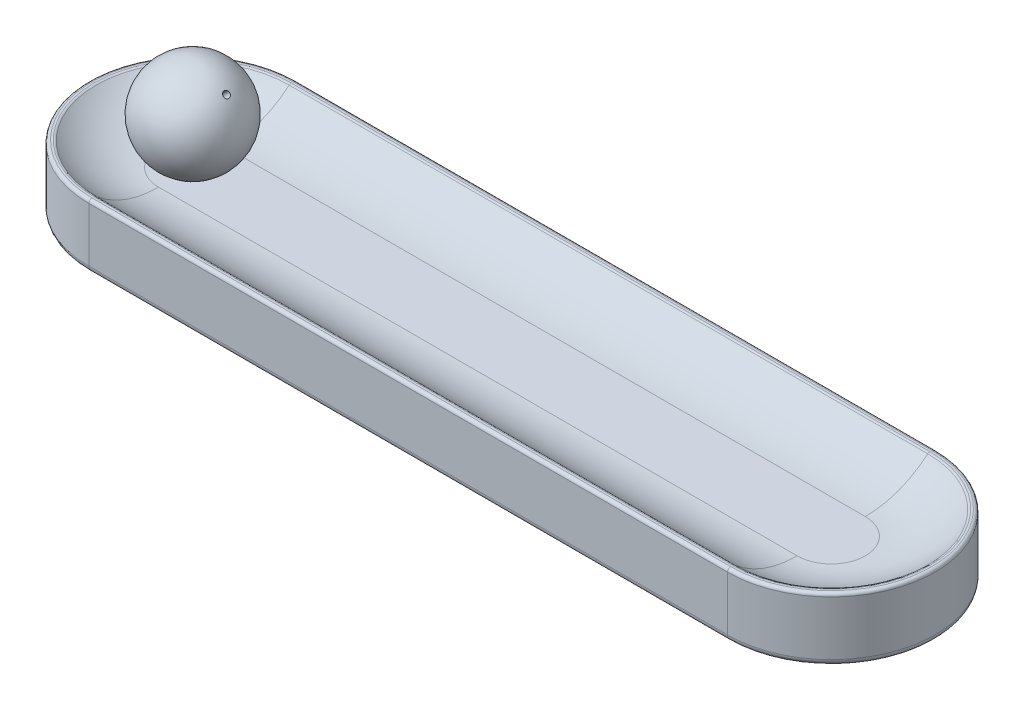
ISO-10303-21;
HEADER;
FILE_DESCRIPTION(('STEP AP214'),'2;1');
FILE_NAME('part.step','',(''),(''),'','','');
FILE_SCHEMA(('AUTOMOTIVE_DESIGN { 1 0 10303 214 1 1 1 1 }'));
ENDSEC;
DATA;
#1=APPLICATION_CONTEXT('core data for automotive mechanical design processes');
#2=APPLICATION_PROTOCOL_DEFINITION('international standard','automotive_design',2000,#1);
#3=PRODUCT_CONTEXT('',#1,'mechanical');
#4=PRODUCT('Part','Part','',(#3));
#5=PRODUCT_RELATED_PRODUCT_CATEGORY('part','',(#4));
#6=PRODUCT_DEFINITION_FORMATION('','',#4);
#7=PRODUCT_DEFINITION_CONTEXT('part definition',#1,'design');
#8=PRODUCT_DEFINITION('design','',#6,#7);
#9=PRODUCT_DEFINITION_SHAPE('','',#8);
#10=(LENGTH_UNIT() NAMED_UNIT(*) SI_UNIT(.MILLI.,.METRE.));
#11=(NAMED_UNIT(*) PLANE_ANGLE_UNIT() SI_UNIT($,.RADIAN.));
#12=(NAMED_UNIT(*) SI_UNIT($,.STERADIAN.) SOLID_ANGLE_UNIT());
#13=UNCERTAINTY_MEASURE_WITH_UNIT(LENGTH_MEASURE(1.E-05),#10,'distance_accuracy_value','');
#14=(GEOMETRIC_REPRESENTATION_CONTEXT(3) GLOBAL_UNCERTAINTY_ASSIGNED_CONTEXT((#13)) GLOBAL_UNIT_ASSIGNED_CONTEXT((#10,
#11,#12)) REPRESENTATION_CONTEXT('',''));
#15=CARTESIAN_POINT('',(0.,0.,0.));
#16=DIRECTION('',(0.,0.,1.));
#17=DIRECTION('',(1.,0.,0.));
#18=AXIS2_PLACEMENT_3D('',#15,#16,#17);
#19=CARTESIAN_POINT('',(-100.,20.,0.));
#20=DIRECTION('',(0.,-1.,0.));
#21=DIRECTION('',(0.,0.,-1.));
#22=AXIS2_PLACEMENT_3D('',#19,#20,#21);
#23=CYLINDRICAL_SURFACE('',#22,32.5);
#24=DIRECTION('',(0.,-1.,0.));
#25=VECTOR('',#24,1.);
#26=CARTESIAN_POINT('',(-100.,20.,-32.5));
#27=LINE('',#26,#25);
#28=CARTESIAN_POINT('',(-100.,19.,-32.5));
#29=VERTEX_POINT('',#28);
#30=CARTESIAN_POINT('',(-100.,2.,-32.5));
#31=VERTEX_POINT('',#30);
#32=EDGE_CURVE('E189',#29,#31,#27,.T.);
#33=ORIENTED_EDGE('',*,*,#32,.T.);
#34=CARTESIAN_POINT('',(-100.,2.,0.));
#35=DIRECTION('',(0.,1.,0.));
#36=DIRECTION('',(0.,0.,1.));
#37=AXIS2_PLACEMENT_3D('',#34,#35,#36);
#38=CIRCLE('',#37,32.5);
#39=CARTESIAN_POINT('',(-100.,2.,32.5));
#40=VERTEX_POINT('',#39);
#41=EDGE_CURVE('E11',#31,#40,#38,.T.);
#42=ORIENTED_EDGE('',*,*,#41,.T.);
#43=DIRECTION('',(0.,-1.,0.));
#44=VECTOR('',#43,1.);
#45=CARTESIAN_POINT('',(-100.,20.,32.5));
#46=LINE('',#45,#44);
#47=CARTESIAN_POINT('',(-100.,19.,32.5));
#48=VERTEX_POINT('',#47);
#49=EDGE_CURVE('E167',#48,#40,#46,.T.);
#50=ORIENTED_EDGE('',*,*,#49,.F.);
#51=CARTESIAN_POINT('',(-100.,19.,0.));
#52=DIRECTION('',(0.,1.,0.));
#53=DIRECTION('',(0.,0.,1.));
#54=AXIS2_PLACEMENT_3D('',#51,#52,#53);
#55=CIRCLE('',#54,32.5);
#56=EDGE_CURVE('E235',#48,#29,#55,.F.);
#57=ORIENTED_EDGE('',*,*,#56,.T.);
#58=EDGE_LOOP('',(#33,#42,#50,#57));
#59=FACE_BOUND('',#58,.T.);
#60=ADVANCED_FACE('F39',(#59),#23,.T.);
#61=CARTESIAN_POINT('',(-100.,20.,32.5));
#62=DIRECTION('',(0.,0.,-1.));
#63=DIRECTION('',(-1.,0.,0.));
#64=AXIS2_PLACEMENT_3D('',#61,#62,#63);
#65=PLANE('',#64);
#66=ORIENTED_EDGE('',*,*,#49,.T.);
#67=DIRECTION('',(1.,0.,0.));
#68=VECTOR('',#67,1.);
#69=CARTESIAN_POINT('',(-100.,2.,32.5));
#70=LINE('',#69,#68);
#71=CARTESIAN_POINT('',(100.,2.,32.5));
#72=VERTEX_POINT('',#71);
#73=EDGE_CURVE('E238',#40,#72,#70,.T.);
#74=ORIENTED_EDGE('',*,*,#73,.T.);
#75=DIRECTION('',(0.,-1.,0.));
#76=VECTOR('',#75,1.);
#77=CARTESIAN_POINT('',(100.,20.,32.5));
#78=LINE('',#77,#76);
#79=CARTESIAN_POINT('',(100.,19.,32.5));
#80=VERTEX_POINT('',#79);
#81=EDGE_CURVE('E320',#80,#72,#78,.T.);
#82=ORIENTED_EDGE('',*,*,#81,.F.);
#83=DIRECTION('',(1.,0.,0.));
#84=VECTOR('',#83,1.);
#85=CARTESIAN_POINT('',(-100.,19.,32.5));
#86=LINE('',#85,#84);
#87=EDGE_CURVE('E229',#80,#48,#86,.F.);
#88=ORIENTED_EDGE('',*,*,#87,.T.);
#89=EDGE_LOOP('',(#66,#74,#82,#88));
#90=FACE_BOUND('',#89,.T.);
#91=ADVANCED_FACE('F380',(#90),#65,.F.);
#92=CARTESIAN_POINT('',(100.,20.,0.));
#93=DIRECTION('',(0.,-1.,0.));
#94=DIRECTION('',(0.,0.,-1.));
#95=AXIS2_PLACEMENT_3D('',#92,#93,#94);
#96=CYLINDRICAL_SURFACE('',#95,32.5);
#97=ORIENTED_EDGE('',*,*,#81,.T.);
#98=CARTESIAN_POINT('',(100.,2.,0.));
#99=DIRECTION('',(0.,1.,0.));
#100=DIRECTION('',(0.,0.,1.));
#101=AXIS2_PLACEMENT_3D('',#98,#99,#100);
#102=CIRCLE('',#101,32.5);
#103=CARTESIAN_POINT('',(100.,2.,-32.5));
#104=VERTEX_POINT('',#103);
#105=EDGE_CURVE('E64',#72,#104,#102,.T.);
#106=ORIENTED_EDGE('',*,*,#105,.T.);
#107=DIRECTION('',(0.,-1.,0.));
#108=VECTOR('',#107,1.);
#109=CARTESIAN_POINT('',(100.,20.,-32.5));
#110=LINE('',#109,#108);
#111=CARTESIAN_POINT('',(100.,19.,-32.5));
#112=VERTEX_POINT('',#111);
#113=EDGE_CURVE('E317',#112,#104,#110,.T.);
#114=ORIENTED_EDGE('',*,*,#113,.F.);
#115=CARTESIAN_POINT('',(100.,19.,0.));
#116=DIRECTION('',(0.,1.,0.));
#117=DIRECTION('',(0.,0.,1.));
#118=AXIS2_PLACEMENT_3D('',#115,#116,#117);
#119=CIRCLE('',#118,32.5);
#120=EDGE_CURVE('E226',#112,#80,#119,.F.);
#121=ORIENTED_EDGE('',*,*,#120,.T.);
#122=EDGE_LOOP('',(#97,#106,#114,#121));
#123=FACE_BOUND('',#122,.T.);
#124=ADVANCED_FACE('F393',(#123),#96,.T.);
#125=CARTESIAN_POINT('',(-100.,20.,-32.5));
#126=DIRECTION('',(0.,0.,1.));
#127=DIRECTION('',(1.,0.,0.));
#128=AXIS2_PLACEMENT_3D('',#125,#126,#127);
#129=PLANE('',#128);
#130=ORIENTED_EDGE('',*,*,#113,.T.);
#131=DIRECTION('',(-1.,0.,0.));
#132=VECTOR('',#131,1.);
#133=CARTESIAN_POINT('',(-100.,2.,-32.5));
#134=LINE('',#133,#132);
#135=EDGE_CURVE('E49',#104,#31,#134,.T.);
#136=ORIENTED_EDGE('',*,*,#135,.T.);
#137=ORIENTED_EDGE('',*,*,#32,.F.);
#138=DIRECTION('',(-1.,0.,0.));
#139=VECTOR('',#138,1.);
#140=CARTESIAN_POINT('',(100.,19.,-32.5));
#141=LINE('',#140,#139);
#142=EDGE_CURVE('E222',#29,#112,#141,.F.);
#143=ORIENTED_EDGE('',*,*,#142,.T.);
#144=EDGE_LOOP('',(#130,#136,#137,#143));
#145=FACE_BOUND('',#144,.T.);
#146=ADVANCED_FACE('F355',(#145),#129,.F.);
#147=CARTESIAN_POINT('',(-100.,20.,0.));
#148=DIRECTION('',(0.,1.,0.));
#149=DIRECTION('',(0.,0.,1.));
#150=AXIS2_PLACEMENT_3D('',#147,#148,#149);
#151=PLANE('',#150);
#152=DIRECTION('',(1.,0.,0.));
#153=VECTOR('',#152,1.);
#154=CARTESIAN_POINT('',(-100.,20.,30.8744317861713));
#155=LINE('',#154,#153);
#156=CARTESIAN_POINT('',(100.,20.,30.8744317861713));
#157=VERTEX_POINT('',#156);
#158=CARTESIAN_POINT('',(-100.,20.,30.8744317861713));
#159=VERTEX_POINT('',#158);
#160=EDGE_CURVE('E203',#157,#159,#155,.F.);
#161=ORIENTED_EDGE('',*,*,#160,.T.);
#162=CARTESIAN_POINT('',(-100.,20.,0.));
#163=DIRECTION('',(0.,1.,0.));
#164=DIRECTION('',(0.,0.,1.));
#165=AXIS2_PLACEMENT_3D('',#162,#163,#164);
#166=CIRCLE('',#165,30.8744317861713);
#167=CARTESIAN_POINT('',(-100.,20.,-30.8744317861713));
#168=VERTEX_POINT('',#167);
#169=EDGE_CURVE('E212',#159,#168,#166,.F.);
#170=ORIENTED_EDGE('',*,*,#169,.T.);
#171=DIRECTION('',(-1.,0.,0.));
#172=VECTOR('',#171,1.);
#173=CARTESIAN_POINT('',(100.,20.,-30.8744317861713));
#174=LINE('',#173,#172);
#175=CARTESIAN_POINT('',(100.,20.,-30.8744317861713));
#176=VERTEX_POINT('',#175);
#177=EDGE_CURVE('E209',#168,#176,#174,.F.);
#178=ORIENTED_EDGE('',*,*,#177,.T.);
#179=CARTESIAN_POINT('',(100.,20.,0.));
#180=DIRECTION('',(0.,1.,0.));
#181=DIRECTION('',(0.,0.,1.));
#182=AXIS2_PLACEMENT_3D('',#179,#180,#181);
#183=CIRCLE('',#182,30.8744317861713);
#184=EDGE_CURVE('E206',#176,#157,#183,.F.);
#185=ORIENTED_EDGE('',*,*,#184,.T.);
#186=EDGE_LOOP('',(#161,#170,#178,#185));
#187=FACE_BOUND('',#186,.T.);
#188=CARTESIAN_POINT('',(100.,20.,0.));
#189=DIRECTION('',(0.,1.,0.));
#190=DIRECTION('',(0.,0.,1.));
#191=AXIS2_PLACEMENT_3D('',#188,#189,#190);
#192=CIRCLE('',#191,31.5);
#193=CARTESIAN_POINT('',(100.,20.,31.5));
#194=VERTEX_POINT('',#193);
#195=CARTESIAN_POINT('',(100.,20.,-31.5));
#196=VERTEX_POINT('',#195);
#197=EDGE_CURVE('E196',#194,#196,#192,.T.);
#198=ORIENTED_EDGE('',*,*,#197,.T.);
#199=DIRECTION('',(-1.,0.,0.));
#200=VECTOR('',#199,1.);
#201=CARTESIAN_POINT('',(-100.,20.,-31.5));
#202=LINE('',#201,#200);
#203=CARTESIAN_POINT('',(-100.,20.,-31.5));
#204=VERTEX_POINT('',#203);
#205=EDGE_CURVE('E199',#196,#204,#202,.T.);
#206=ORIENTED_EDGE('',*,*,#205,.T.);
#207=CARTESIAN_POINT('',(-100.,20.,0.));
#208=DIRECTION('',(0.,1.,0.));
#209=DIRECTION('',(0.,0.,1.));
#210=AXIS2_PLACEMENT_3D('',#207,#208,#209);
#211=CIRCLE('',#210,31.5);
#212=CARTESIAN_POINT('',(-100.,20.,31.5));
#213=VERTEX_POINT('',#212);
#214=EDGE_CURVE('E177',#204,#213,#211,.T.);
#215=ORIENTED_EDGE('',*,*,#214,.T.);
#216=DIRECTION('',(1.,0.,0.));
#217=VECTOR('',#216,1.);
#218=CARTESIAN_POINT('',(100.,20.,31.5));
#219=LINE('',#218,#217);
#220=EDGE_CURVE('E193',#213,#194,#219,.T.);
#221=ORIENTED_EDGE('',*,*,#220,.T.);
#222=EDGE_LOOP('',(#198,#206,#215,#221));
#223=FACE_BOUND('',#222,.T.);
#224=ADVANCED_FACE('F351',(#187,#223),#151,.T.);
#225=CARTESIAN_POINT('',(-100.,0.,0.));
#226=DIRECTION('',(0.,1.,0.));
#227=DIRECTION('',(0.,0.,1.));
#228=AXIS2_PLACEMENT_3D('',#225,#226,#227);
#229=PLANE('',#228);
#230=CARTESIAN_POINT('',(100.,0.,0.));
#231=DIRECTION('',(0.,1.,0.));
#232=DIRECTION('',(0.,0.,1.));
#233=AXIS2_PLACEMENT_3D('',#230,#231,#232);
#234=CIRCLE('',#233,30.5);
#235=CARTESIAN_POINT('',(100.,0.,-30.5));
#236=VERTEX_POINT('',#235);
#237=CARTESIAN_POINT('',(100.,0.,30.5));
#238=VERTEX_POINT('',#237);
#239=EDGE_CURVE('E276',#236,#238,#234,.F.);
#240=ORIENTED_EDGE('',*,*,#239,.T.);
#241=DIRECTION('',(1.,0.,0.));
#242=VECTOR('',#241,1.);
#243=CARTESIAN_POINT('',(-100.,0.,30.5));
#244=LINE('',#243,#242);
#245=CARTESIAN_POINT('',(-100.,0.,30.5));
#246=VERTEX_POINT('',#245);
#247=EDGE_CURVE('E279',#238,#246,#244,.F.);
#248=ORIENTED_EDGE('',*,*,#247,.T.);
#249=CARTESIAN_POINT('',(-100.,0.,0.));
#250=DIRECTION('',(0.,1.,0.));
#251=DIRECTION('',(0.,0.,1.));
#252=AXIS2_PLACEMENT_3D('',#249,#250,#251);
#253=CIRCLE('',#252,30.5);
#254=CARTESIAN_POINT('',(-100.,0.,-30.5));
#255=VERTEX_POINT('',#254);
#256=EDGE_CURVE('E270',#246,#255,#253,.F.);
#257=ORIENTED_EDGE('',*,*,#256,.T.);
#258=DIRECTION('',(-1.,0.,0.));
#259=VECTOR('',#258,1.);
#260=CARTESIAN_POINT('',(-100.,0.,-30.5));
#261=LINE('',#260,#259);
#262=EDGE_CURVE('E273',#255,#236,#261,.F.);
#263=ORIENTED_EDGE('',*,*,#262,.T.);
#264=EDGE_LOOP('',(#240,#248,#257,#263));
#265=FACE_BOUND('',#264,.T.);
#266=ADVANCED_FACE('F354',(#265),#229,.F.);
#267=CARTESIAN_POINT('',(-100.,12.5,0.));
#268=DIRECTION('',(0.,1.,0.));
#269=DIRECTION('',(0.,0.,1.));
#270=AXIS2_PLACEMENT_3D('',#267,#268,#269);
#271=PLANE('',#270);
#272=CARTESIAN_POINT('',(-100.,12.5,0.));
#273=DIRECTION('',(0.,1.,0.));
#274=DIRECTION('',(0.,0.,1.));
#275=AXIS2_PLACEMENT_3D('',#272,#273,#274);
#276=CIRCLE('',#275,3.84057287393431);
#277=CARTESIAN_POINT('',(-100.,12.5,3.84057287393431));
#278=VERTEX_POINT('',#277);
#279=EDGE_CURVE('E291',#278,#278,#276,.F.);
#280=ORIENTED_EDGE('',*,*,#279,.T.);
#281=EDGE_LOOP('',(#280));
#282=FACE_BOUND('',#281,.T.);
#283=DIRECTION('',(-1.,0.,0.));
#284=VECTOR('',#283,1.);
#285=CARTESIAN_POINT('',(-100.,12.5,-10.6568651670156));
#286=LINE('',#285,#284);
#287=CARTESIAN_POINT('',(100.,12.5,-10.6568651670156));
#288=VERTEX_POINT('',#287);
#289=CARTESIAN_POINT('',(-100.,12.5,-10.6568651670156));
#290=VERTEX_POINT('',#289);
#291=EDGE_CURVE('E171',#288,#290,#286,.T.);
#292=ORIENTED_EDGE('',*,*,#291,.T.);
#293=CARTESIAN_POINT('',(-100.,12.5,0.));
#294=DIRECTION('',(0.,1.,0.));
#295=DIRECTION('',(0.,0.,1.));
#296=AXIS2_PLACEMENT_3D('',#293,#294,#295);
#297=CIRCLE('',#296,10.6568651670156);
#298=CARTESIAN_POINT('',(-100.,12.5,10.6568651670156));
#299=VERTEX_POINT('',#298);
#300=EDGE_CURVE('E150',#290,#299,#297,.T.);
#301=ORIENTED_EDGE('',*,*,#300,.T.);
#302=DIRECTION('',(1.,0.,0.));
#303=VECTOR('',#302,1.);
#304=CARTESIAN_POINT('',(100.,12.5,10.6568651670156));
#305=LINE('',#304,#303);
#306=CARTESIAN_POINT('',(100.,12.5,10.6568651670156));
#307=VERTEX_POINT('',#306);
#308=EDGE_CURVE('E159',#299,#307,#305,.T.);
#309=ORIENTED_EDGE('',*,*,#308,.T.);
#310=CARTESIAN_POINT('',(100.,12.5,0.));
#311=DIRECTION('',(0.,1.,0.));
#312=DIRECTION('',(0.,0.,1.));
#313=AXIS2_PLACEMENT_3D('',#310,#311,#312);
#314=CIRCLE('',#313,10.6568651670156);
#315=EDGE_CURVE('E166',#307,#288,#314,.T.);
#316=ORIENTED_EDGE('',*,*,#315,.T.);
#317=EDGE_LOOP('',(#292,#301,#309,#316));
#318=FACE_BOUND('',#317,.T.);
#319=ADVANCED_FACE('F169',(#282,#318),#271,.T.);
#320=CARTESIAN_POINT('',(100.,42.5,0.));
#321=DIRECTION('',(0.,-1.,0.));
#322=DIRECTION('',(0.,0.,-1.));
#323=AXIS2_PLACEMENT_3D('',#320,#321,#322);
#324=DEGENERATE_TOROIDAL_SURFACE('',#323,10.6568651670156,30.,.T.);
#325=CARTESIAN_POINT('',(100.,42.5,10.6568651670156));
#326=DIRECTION('',(1.,0.,0.));
#327=DIRECTION('',(0.,0.,-1.));
#328=AXIS2_PLACEMENT_3D('',#325,#326,#327);
#329=CIRCLE('',#328,30.);
#330=CARTESIAN_POINT('',(100.,19.758064516129,30.2222522178114));
#331=VERTEX_POINT('',#330);
#332=EDGE_CURVE('E162',#331,#307,#329,.T.);
#333=ORIENTED_EDGE('',*,*,#332,.F.);
#334=CARTESIAN_POINT('',(100.,19.758064516129,0.));
#335=DIRECTION('',(0.,1.,0.));
#336=DIRECTION('',(0.,0.,1.));
#337=AXIS2_PLACEMENT_3D('',#334,#335,#336);
#338=CIRCLE('',#337,30.2222522178114);
#339=CARTESIAN_POINT('',(100.,19.758064516129,-30.2222522178114));
#340=VERTEX_POINT('',#339);
#341=EDGE_CURVE('E219',#331,#340,#338,.T.);
#342=ORIENTED_EDGE('',*,*,#341,.T.);
#343=CARTESIAN_POINT('',(100.,42.5,-10.6568651670156));
#344=DIRECTION('',(1.,0.,0.));
#345=DIRECTION('',(0.,0.,-1.));
#346=AXIS2_PLACEMENT_3D('',#343,#344,#345);
#347=CIRCLE('',#346,30.);
#348=EDGE_CURVE('E186',#288,#340,#347,.T.);
#349=ORIENTED_EDGE('',*,*,#348,.F.);
#350=ORIENTED_EDGE('',*,*,#315,.F.);
#351=EDGE_LOOP('',(#333,#342,#349,#350));
#352=FACE_BOUND('',#351,.T.);
#353=ADVANCED_FACE('F328',(#352),#324,.F.);
#354=CARTESIAN_POINT('',(100.,42.5,-10.6568651670156));
#355=DIRECTION('',(1.,0.,0.));
#356=DIRECTION('',(0.,0.,-1.));
#357=AXIS2_PLACEMENT_3D('',#354,#355,#356);
#358=CYLINDRICAL_SURFACE('',#357,30.);
#359=ORIENTED_EDGE('',*,*,#348,.T.);
#360=DIRECTION('',(1.,0.,0.));
#361=VECTOR('',#360,1.);
#362=CARTESIAN_POINT('',(100.,19.758064516129,-30.2222522178114));
#363=LINE('',#362,#361);
#364=CARTESIAN_POINT('',(-100.,19.758064516129,-30.2222522178114));
#365=VERTEX_POINT('',#364);
#366=EDGE_CURVE('E216',#340,#365,#363,.F.);
#367=ORIENTED_EDGE('',*,*,#366,.T.);
#368=CARTESIAN_POINT('',(-100.,42.5,-10.6568651670156));
#369=DIRECTION('',(1.,0.,0.));
#370=DIRECTION('',(0.,0.,-1.));
#371=AXIS2_PLACEMENT_3D('',#368,#369,#370);
#372=CIRCLE('',#371,30.);
#373=EDGE_CURVE('E155',#290,#365,#372,.T.);
#374=ORIENTED_EDGE('',*,*,#373,.F.);
#375=ORIENTED_EDGE('',*,*,#291,.F.);
#376=EDGE_LOOP('',(#359,#367,#374,#375));
#377=FACE_BOUND('',#376,.T.);
#378=ADVANCED_FACE('F332',(#377),#358,.F.);
#379=CARTESIAN_POINT('',(-100.,42.5,10.6568651670156));
#380=DIRECTION('',(-1.,0.,0.));
#381=DIRECTION('',(0.,0.,1.));
#382=AXIS2_PLACEMENT_3D('',#379,#380,#381);
#383=CYLINDRICAL_SURFACE('',#382,30.);
#384=CARTESIAN_POINT('',(-100.,42.5,10.6568651670156));
#385=DIRECTION('',(1.,0.,0.));
#386=DIRECTION('',(0.,0.,-1.));
#387=AXIS2_PLACEMENT_3D('',#384,#385,#386);
#388=CIRCLE('',#387,30.);
#389=CARTESIAN_POINT('',(-100.,19.758064516129,30.2222522178114));
#390=VERTEX_POINT('',#389);
#391=EDGE_CURVE('E145',#390,#299,#388,.T.);
#392=ORIENTED_EDGE('',*,*,#391,.F.);
#393=DIRECTION('',(-1.,0.,0.));
#394=VECTOR('',#393,1.);
#395=CARTESIAN_POINT('',(-100.,19.758064516129,30.2222522178114));
#396=LINE('',#395,#394);
#397=EDGE_CURVE('E232',#390,#331,#396,.F.);
#398=ORIENTED_EDGE('',*,*,#397,.T.);
#399=ORIENTED_EDGE('',*,*,#332,.T.);
#400=ORIENTED_EDGE('',*,*,#308,.F.);
#401=EDGE_LOOP('',(#392,#398,#399,#400));
#402=FACE_BOUND('',#401,.T.);
#403=ADVANCED_FACE('F160',(#402),#383,.F.);
#404=CARTESIAN_POINT('',(-100.,42.5,0.));
#405=DIRECTION('',(0.,-1.,0.));
#406=DIRECTION('',(0.,0.,-1.));
#407=AXIS2_PLACEMENT_3D('',#404,#405,#406);
#408=DEGENERATE_TOROIDAL_SURFACE('',#407,10.6568651670156,30.,.T.);
#409=ORIENTED_EDGE('',*,*,#373,.T.);
#410=CARTESIAN_POINT('',(-100.,19.758064516129,0.));
#411=DIRECTION('',(0.,1.,0.));
#412=DIRECTION('',(0.,0.,1.));
#413=AXIS2_PLACEMENT_3D('',#410,#411,#412);
#414=CIRCLE('',#413,30.2222522178114);
#415=EDGE_CURVE('E152',#365,#390,#414,.T.);
#416=ORIENTED_EDGE('',*,*,#415,.T.);
#417=ORIENTED_EDGE('',*,*,#391,.T.);
#418=ORIENTED_EDGE('',*,*,#300,.F.);
#419=EDGE_LOOP('',(#409,#416,#417,#418));
#420=FACE_BOUND('',#419,.T.);
#421=ADVANCED_FACE('F148',(#420),#408,.F.);
#422=CARTESIAN_POINT('',(100.,19.,0.));
#423=DIRECTION('',(0.,1.,0.));
#424=DIRECTION('',(0.,0.,1.));
#425=AXIS2_PLACEMENT_3D('',#422,#423,#424);
#426=TOROIDAL_SURFACE('',#425,30.8744317861713,1.);
#427=CARTESIAN_POINT('',(100.,19.,30.8744317861713));
#428=DIRECTION('',(-1.,0.,0.));
#429=DIRECTION('',(0.,0.,1.));
#430=AXIS2_PLACEMENT_3D('',#427,#428,#429);
#431=CIRCLE('',#430,1.);
#432=EDGE_CURVE('E246',#157,#331,#431,.T.);
#433=ORIENTED_EDGE('',*,*,#432,.F.);
#434=ORIENTED_EDGE('',*,*,#184,.F.);
#435=CARTESIAN_POINT('',(100.,19.,-30.8744317861713));
#436=DIRECTION('',(-1.,0.,0.));
#437=DIRECTION('',(0.,0.,1.));
#438=AXIS2_PLACEMENT_3D('',#435,#436,#437);
#439=CIRCLE('',#438,1.);
#440=EDGE_CURVE('E156',#340,#176,#439,.T.);
#441=ORIENTED_EDGE('',*,*,#440,.F.);
#442=ORIENTED_EDGE('',*,*,#341,.F.);
#443=EDGE_LOOP('',(#433,#434,#441,#442));
#444=FACE_BOUND('',#443,.T.);
#445=ADVANCED_FACE('F348',(#444),#426,.T.);
#446=CARTESIAN_POINT('',(100.,19.,-30.8744317861713));
#447=DIRECTION('',(1.,0.,0.));
#448=DIRECTION('',(0.,0.,-1.));
#449=AXIS2_PLACEMENT_3D('',#446,#447,#448);
#450=CYLINDRICAL_SURFACE('',#449,1.);
#451=ORIENTED_EDGE('',*,*,#440,.T.);
#452=ORIENTED_EDGE('',*,*,#177,.F.);
#453=CARTESIAN_POINT('',(-100.,19.,-30.8744317861713));
#454=DIRECTION('',(-1.,0.,0.));
#455=DIRECTION('',(0.,0.,1.));
#456=AXIS2_PLACEMENT_3D('',#453,#454,#455);
#457=CIRCLE('',#456,1.);
#458=EDGE_CURVE('E242',#365,#168,#457,.T.);
#459=ORIENTED_EDGE('',*,*,#458,.F.);
#460=ORIENTED_EDGE('',*,*,#366,.F.);
#461=EDGE_LOOP('',(#451,#452,#459,#460));
#462=FACE_BOUND('',#461,.T.);
#463=ADVANCED_FACE('F337',(#462),#450,.T.);
#464=CARTESIAN_POINT('',(-100.,19.,30.8744317861713));
#465=DIRECTION('',(-1.,0.,0.));
#466=DIRECTION('',(0.,0.,1.));
#467=AXIS2_PLACEMENT_3D('',#464,#465,#466);
#468=CYLINDRICAL_SURFACE('',#467,1.);
#469=ORIENTED_EDGE('',*,*,#432,.T.);
#470=ORIENTED_EDGE('',*,*,#397,.F.);
#471=CARTESIAN_POINT('',(-100.,19.,30.8744317861713));
#472=DIRECTION('',(-1.,0.,0.));
#473=DIRECTION('',(0.,0.,1.));
#474=AXIS2_PLACEMENT_3D('',#471,#472,#473);
#475=CIRCLE('',#474,1.);
#476=EDGE_CURVE('E239',#159,#390,#475,.T.);
#477=ORIENTED_EDGE('',*,*,#476,.F.);
#478=ORIENTED_EDGE('',*,*,#160,.F.);
#479=EDGE_LOOP('',(#469,#470,#477,#478));
#480=FACE_BOUND('',#479,.T.);
#481=ADVANCED_FACE('F345',(#480),#468,.T.);
#482=CARTESIAN_POINT('',(-100.,19.,0.));
#483=DIRECTION('',(0.,1.,0.));
#484=DIRECTION('',(0.,0.,1.));
#485=AXIS2_PLACEMENT_3D('',#482,#483,#484);
#486=TOROIDAL_SURFACE('',#485,30.8744317861713,1.);
#487=ORIENTED_EDGE('',*,*,#458,.T.);
#488=ORIENTED_EDGE('',*,*,#169,.F.);
#489=ORIENTED_EDGE('',*,*,#476,.T.);
#490=ORIENTED_EDGE('',*,*,#415,.F.);
#491=EDGE_LOOP('',(#487,#488,#489,#490));
#492=FACE_BOUND('',#491,.T.);
#493=ADVANCED_FACE('F340',(#492),#486,.T.);
#494=CARTESIAN_POINT('',(-100.,19.,31.5));
#495=DIRECTION('',(-1.,0.,0.));
#496=DIRECTION('',(0.,0.,1.));
#497=AXIS2_PLACEMENT_3D('',#494,#495,#496);
#498=CYLINDRICAL_SURFACE('',#497,1.);
#499=CARTESIAN_POINT('',(-100.,19.,31.5));
#500=DIRECTION('',(-1.,0.,0.));
#501=DIRECTION('',(0.,0.,1.));
#502=AXIS2_PLACEMENT_3D('',#499,#500,#501);
#503=CIRCLE('',#502,1.);
#504=EDGE_CURVE('E260',#48,#213,#503,.T.);
#505=ORIENTED_EDGE('',*,*,#504,.F.);
#506=ORIENTED_EDGE('',*,*,#87,.F.);
#507=CARTESIAN_POINT('',(100.,19.,31.5));
#508=DIRECTION('',(1.,0.,0.));
#509=DIRECTION('',(0.,0.,-1.));
#510=AXIS2_PLACEMENT_3D('',#507,#508,#509);
#511=CIRCLE('',#510,1.);
#512=EDGE_CURVE('E243',#194,#80,#511,.T.);
#513=ORIENTED_EDGE('',*,*,#512,.F.);
#514=ORIENTED_EDGE('',*,*,#220,.F.);
#515=EDGE_LOOP('',(#505,#506,#513,#514));
#516=FACE_BOUND('',#515,.T.);
#517=ADVANCED_FACE('F375',(#516),#498,.T.);
#518=CARTESIAN_POINT('',(100.,19.,0.));
#519=DIRECTION('',(0.,1.,0.));
#520=DIRECTION('',(0.,0.,1.));
#521=AXIS2_PLACEMENT_3D('',#518,#519,#520);
#522=TOROIDAL_SURFACE('',#521,31.5,1.);
#523=ORIENTED_EDGE('',*,*,#512,.T.);
#524=ORIENTED_EDGE('',*,*,#120,.F.);
#525=CARTESIAN_POINT('',(100.,19.,-31.5));
#526=DIRECTION('',(-1.,0.,0.));
#527=DIRECTION('',(0.,0.,1.));
#528=AXIS2_PLACEMENT_3D('',#525,#526,#527);
#529=CIRCLE('',#528,1.);
#530=EDGE_CURVE('E256',#196,#112,#529,.T.);
#531=ORIENTED_EDGE('',*,*,#530,.F.);
#532=ORIENTED_EDGE('',*,*,#197,.F.);
#533=EDGE_LOOP('',(#523,#524,#531,#532));
#534=FACE_BOUND('',#533,.T.);
#535=ADVANCED_FACE('F364',(#534),#522,.T.);
#536=CARTESIAN_POINT('',(-100.,19.,0.));
#537=DIRECTION('',(0.,1.,0.));
#538=DIRECTION('',(0.,0.,1.));
#539=AXIS2_PLACEMENT_3D('',#536,#537,#538);
#540=TOROIDAL_SURFACE('',#539,31.5,1.);
#541=ORIENTED_EDGE('',*,*,#504,.T.);
#542=ORIENTED_EDGE('',*,*,#214,.F.);
#543=CARTESIAN_POINT('',(-100.,19.,-31.5));
#544=DIRECTION('',(1.,0.,0.));
#545=DIRECTION('',(0.,0.,-1.));
#546=AXIS2_PLACEMENT_3D('',#543,#544,#545);
#547=CIRCLE('',#546,1.);
#548=EDGE_CURVE('E253',#29,#204,#547,.T.);
#549=ORIENTED_EDGE('',*,*,#548,.F.);
#550=ORIENTED_EDGE('',*,*,#56,.F.);
#551=EDGE_LOOP('',(#541,#542,#549,#550));
#552=FACE_BOUND('',#551,.T.);
#553=ADVANCED_FACE('F372',(#552),#540,.T.);
#554=CARTESIAN_POINT('',(-100.,19.,-31.5));
#555=DIRECTION('',(1.,0.,0.));
#556=DIRECTION('',(0.,0.,-1.));
#557=AXIS2_PLACEMENT_3D('',#554,#555,#556);
#558=CYLINDRICAL_SURFACE('',#557,1.);
#559=ORIENTED_EDGE('',*,*,#530,.T.);
#560=ORIENTED_EDGE('',*,*,#142,.F.);
#561=ORIENTED_EDGE('',*,*,#548,.T.);
#562=ORIENTED_EDGE('',*,*,#205,.F.);
#563=EDGE_LOOP('',(#559,#560,#561,#562));
#564=FACE_BOUND('',#563,.T.);
#565=ADVANCED_FACE('F367',(#564),#558,.T.);
#566=CARTESIAN_POINT('',(-100.,2.,-30.5));
#567=DIRECTION('',(-1.,0.,0.));
#568=DIRECTION('',(0.,0.,1.));
#569=AXIS2_PLACEMENT_3D('',#566,#567,#568);
#570=CYLINDRICAL_SURFACE('',#569,2.);
#571=CARTESIAN_POINT('',(100.,2.,-30.5));
#572=DIRECTION('',(1.,0.,0.));
#573=DIRECTION('',(0.,0.,-1.));
#574=AXIS2_PLACEMENT_3D('',#571,#572,#573);
#575=CIRCLE('',#574,2.);
#576=EDGE_CURVE('E294',#236,#104,#575,.T.);
#577=ORIENTED_EDGE('',*,*,#576,.F.);
#578=ORIENTED_EDGE('',*,*,#262,.F.);
#579=CARTESIAN_POINT('',(-100.,2.,-30.5));
#580=DIRECTION('',(-1.,0.,0.));
#581=DIRECTION('',(0.,0.,1.));
#582=AXIS2_PLACEMENT_3D('',#579,#580,#581);
#583=CIRCLE('',#582,2.);
#584=EDGE_CURVE('E257',#31,#255,#583,.T.);
#585=ORIENTED_EDGE('',*,*,#584,.F.);
#586=ORIENTED_EDGE('',*,*,#135,.F.);
#587=EDGE_LOOP('',(#577,#578,#585,#586));
#588=FACE_BOUND('',#587,.T.);
#589=ADVANCED_FACE('F41',(#588),#570,.T.);
#590=CARTESIAN_POINT('',(-100.,2.,0.));
#591=DIRECTION('',(0.,1.,0.));
#592=DIRECTION('',(0.,0.,1.));
#593=AXIS2_PLACEMENT_3D('',#590,#591,#592);
#594=TOROIDAL_SURFACE('',#593,30.5,2.);
#595=ORIENTED_EDGE('',*,*,#584,.T.);
#596=ORIENTED_EDGE('',*,*,#256,.F.);
#597=CARTESIAN_POINT('',(-100.,2.,30.5));
#598=DIRECTION('',(1.,0.,0.));
#599=DIRECTION('',(0.,0.,-1.));
#600=AXIS2_PLACEMENT_3D('',#597,#598,#599);
#601=CIRCLE('',#600,2.);
#602=EDGE_CURVE('E290',#40,#246,#601,.T.);
#603=ORIENTED_EDGE('',*,*,#602,.F.);
#604=ORIENTED_EDGE('',*,*,#41,.F.);
#605=EDGE_LOOP('',(#595,#596,#603,#604));
#606=FACE_BOUND('',#605,.T.);
#607=ADVANCED_FACE('F386',(#606),#594,.T.);
#608=CARTESIAN_POINT('',(100.,2.,0.));
#609=DIRECTION('',(0.,1.,0.));
#610=DIRECTION('',(0.,0.,1.));
#611=AXIS2_PLACEMENT_3D('',#608,#609,#610);
#612=TOROIDAL_SURFACE('',#611,30.5,2.);
#613=ORIENTED_EDGE('',*,*,#576,.T.);
#614=ORIENTED_EDGE('',*,*,#105,.F.);
#615=CARTESIAN_POINT('',(100.,2.,30.5));
#616=DIRECTION('',(-1.,0.,0.));
#617=DIRECTION('',(0.,0.,1.));
#618=AXIS2_PLACEMENT_3D('',#615,#616,#617);
#619=CIRCLE('',#618,2.);
#620=EDGE_CURVE('E287',#238,#72,#619,.T.);
#621=ORIENTED_EDGE('',*,*,#620,.F.);
#622=ORIENTED_EDGE('',*,*,#239,.F.);
#623=EDGE_LOOP('',(#613,#614,#621,#622));
#624=FACE_BOUND('',#623,.T.);
#625=ADVANCED_FACE('F399',(#624),#612,.T.);
#626=CARTESIAN_POINT('',(-100.,2.,30.5));
#627=DIRECTION('',(1.,0.,0.));
#628=DIRECTION('',(0.,0.,-1.));
#629=AXIS2_PLACEMENT_3D('',#626,#627,#628);
#630=CYLINDRICAL_SURFACE('',#629,2.);
#631=ORIENTED_EDGE('',*,*,#602,.T.);
#632=ORIENTED_EDGE('',*,*,#247,.F.);
#633=ORIENTED_EDGE('',*,*,#620,.T.);
#634=ORIENTED_EDGE('',*,*,#73,.F.);
#635=EDGE_LOOP('',(#631,#632,#633,#634));
#636=FACE_BOUND('',#635,.T.);
#637=ADVANCED_FACE('F391',(#636),#630,.T.);
#638=CARTESIAN_POINT('',(-100.,27.,0.));
#639=DIRECTION('',(0.,-1.,0.));
#640=DIRECTION('',(-1.,0.,0.));
#641=AXIS2_PLACEMENT_3D('',#638,#639,#640);
#642=SPHERICAL_SURFACE('',#641,15.);
#643=CARTESIAN_POINT('',(-89.4169947557416,37.5830052442583,0.));
#644=DIRECTION('',(-0.707106781186546,-0.707106781186549,0.));
#645=DIRECTION('',(0.707106781186549,-0.707106781186546,0.));
#646=AXIS2_PLACEMENT_3D('',#643,#644,#645);
#647=CIRCLE('',#646,0.999999999999995);
#648=CARTESIAN_POINT('',(-88.7098879745551,36.8758984630718,0.));
#649=VERTEX_POINT('',#648);
#650=EDGE_CURVE('E43',#649,#649,#647,.T.);
#651=ORIENTED_EDGE('',*,*,#650,.T.);
#652=EDGE_LOOP('',(#651));
#653=FACE_BOUND('',#652,.T.);
#654=ORIENTED_EDGE('',*,*,#279,.F.);
#655=EDGE_LOOP('',(#654));
#656=FACE_BOUND('',#655,.T.);
#657=ADVANCED_FACE('F442',(#653,#656),#642,.T.);
#658=CARTESIAN_POINT('',(-100.,27.,0.));
#659=DIRECTION('',(0.707106781186546,0.707106781186549,0.));
#660=DIRECTION('',(-0.707106781186549,0.707106781186546,0.));
#661=AXIS2_PLACEMENT_3D('',#658,#659,#660);
#662=CYLINDRICAL_SURFACE('',#661,0.999999999999995);
#663=CARTESIAN_POINT('',(-100.,27.,0.));
#664=DIRECTION('',(0.707106781186546,0.707106781186549,0.));
#665=DIRECTION('',(-0.707106781186549,0.707106781186546,0.));
#666=AXIS2_PLACEMENT_3D('',#663,#664,#665);
#667=CIRCLE('',#666,0.999999999999995);
#668=CARTESIAN_POINT('',(-100.707106781187,27.7071067811865,0.));
#669=VERTEX_POINT('',#668);
#670=EDGE_CURVE('E306',#669,#669,#667,.T.);
#671=ORIENTED_EDGE('',*,*,#670,.F.);
#672=EDGE_LOOP('',(#671));
#673=FACE_BOUND('',#672,.T.);
#674=ORIENTED_EDGE('',*,*,#650,.F.);
#675=EDGE_LOOP('',(#674));
#676=FACE_BOUND('',#675,.T.);
#677=ADVANCED_FACE('F517',(#673,#676),#662,.F.);
#678=CARTESIAN_POINT('',(-100.,27.,0.));
#679=DIRECTION('',(0.707106781186546,0.707106781186549,0.));
#680=DIRECTION('',(-0.707106781186549,0.707106781186546,0.));
#681=AXIS2_PLACEMENT_3D('',#678,#679,#680);
#682=PLANE('',#681);
#683=ORIENTED_EDGE('',*,*,#670,.T.);
#684=EDGE_LOOP('',(#683));
#685=FACE_BOUND('',#684,.T.);
#686=ADVANCED_FACE('F526',(#685),#682,.T.);
#687=CLOSED_SHELL('',(#60,#91,#124,#146,#224,#266,#319,#353,#378,#403,#421,#445,#463,#481,#493,
#517,#535,#553,#565,#589,#607,#625,#637,#657,#677,#686));
#688=MANIFOLD_SOLID_BREP('B2',#687);
#689=ADVANCED_BREP_SHAPE_REPRESENTATION('',(#18,#688),#14);
#690=SHAPE_DEFINITION_REPRESENTATION(#9,#689);
ENDSEC;
END-ISO-10303-21;
